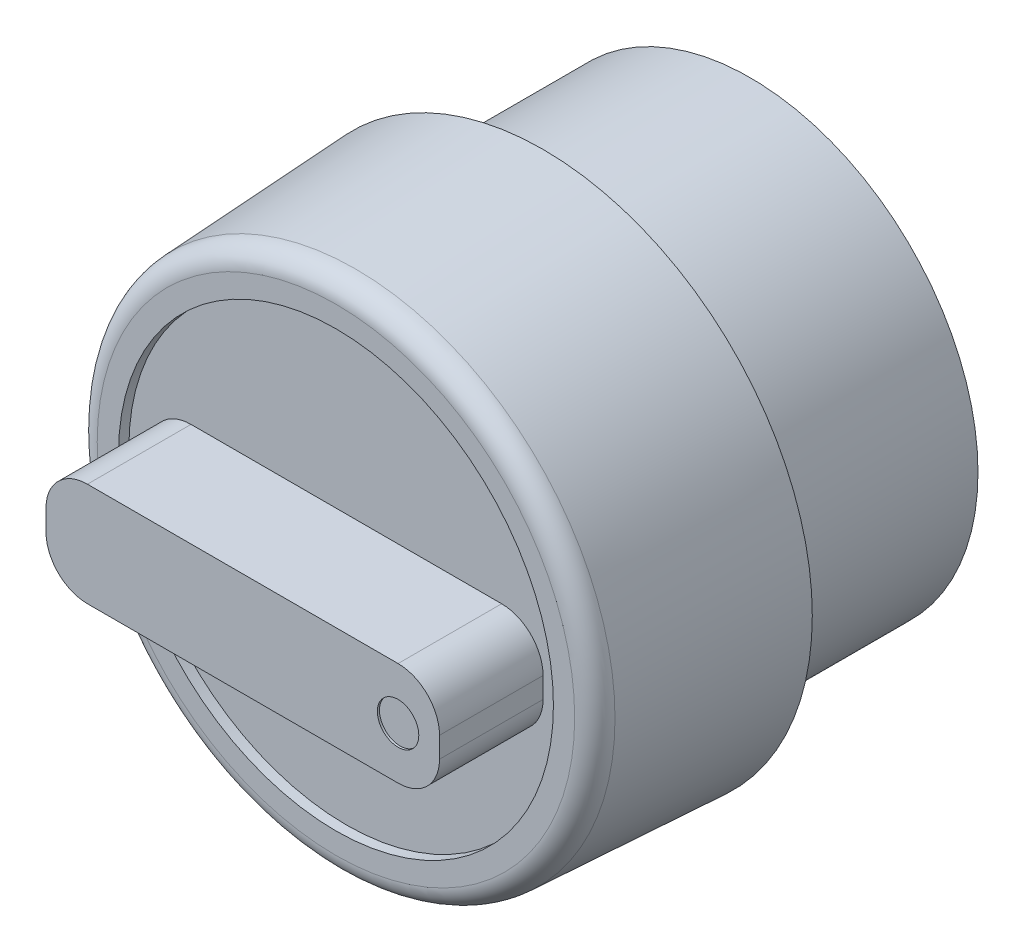
ISO-10303-21;
HEADER;
FILE_DESCRIPTION(('STEP AP214'),'2;1');
FILE_NAME('part.step','',(''),(''),'','','');
FILE_SCHEMA(('AUTOMOTIVE_DESIGN { 1 0 10303 214 1 1 1 1 }'));
ENDSEC;
DATA;
#1=APPLICATION_CONTEXT('core data for automotive mechanical design processes');
#2=APPLICATION_PROTOCOL_DEFINITION('international standard','automotive_design',2000,#1);
#3=PRODUCT_CONTEXT('',#1,'mechanical');
#4=PRODUCT('Part','Part','',(#3));
#5=PRODUCT_RELATED_PRODUCT_CATEGORY('part','',(#4));
#6=PRODUCT_DEFINITION_FORMATION('','',#4);
#7=PRODUCT_DEFINITION_CONTEXT('part definition',#1,'design');
#8=PRODUCT_DEFINITION('design','',#6,#7);
#9=PRODUCT_DEFINITION_SHAPE('','',#8);
#10=(LENGTH_UNIT() NAMED_UNIT(*) SI_UNIT(.MILLI.,.METRE.));
#11=(NAMED_UNIT(*) PLANE_ANGLE_UNIT() SI_UNIT($,.RADIAN.));
#12=(NAMED_UNIT(*) SI_UNIT($,.STERADIAN.) SOLID_ANGLE_UNIT());
#13=UNCERTAINTY_MEASURE_WITH_UNIT(LENGTH_MEASURE(1.E-05),#10,'distance_accuracy_value','');
#14=(GEOMETRIC_REPRESENTATION_CONTEXT(3) GLOBAL_UNCERTAINTY_ASSIGNED_CONTEXT((#13)) GLOBAL_UNIT_ASSIGNED_CONTEXT((#10,
#11,#12)) REPRESENTATION_CONTEXT('',''));
#15=CARTESIAN_POINT('',(0.,0.,0.));
#16=DIRECTION('',(0.,0.,1.));
#17=DIRECTION('',(1.,0.,0.));
#18=AXIS2_PLACEMENT_3D('',#15,#16,#17);
#19=CARTESIAN_POINT('',(0.,0.,19.5));
#20=DIRECTION('',(0.,0.,1.));
#21=DIRECTION('',(1.,0.,0.));
#22=AXIS2_PLACEMENT_3D('',#19,#20,#21);
#23=PLANE('',#22);
#24=CARTESIAN_POINT('',(0.,0.,19.5));
#25=DIRECTION('',(0.,0.,1.));
#26=DIRECTION('',(1.,0.,0.));
#27=AXIS2_PLACEMENT_3D('',#24,#25,#26);
#28=CIRCLE('',#27,10.5);
#29=CARTESIAN_POINT('',(10.5,0.,19.5));
#30=VERTEX_POINT('',#29);
#31=EDGE_CURVE('E131',#30,#30,#28,.T.);
#32=ORIENTED_EDGE('',*,*,#31,.T.);
#33=EDGE_LOOP('',(#32));
#34=FACE_BOUND('',#33,.T.);
#35=DIRECTION('',(1.,0.,0.));
#36=VECTOR('',#35,1.);
#37=CARTESIAN_POINT('',(-9.5,-2.5,19.5));
#38=LINE('',#37,#36);
#39=CARTESIAN_POINT('',(-7.5,-2.5,19.5));
#40=VERTEX_POINT('',#39);
#41=CARTESIAN_POINT('',(7.5,-2.5,19.5));
#42=VERTEX_POINT('',#41);
#43=EDGE_CURVE('E127',#40,#42,#38,.T.);
#44=ORIENTED_EDGE('',*,*,#43,.F.);
#45=CARTESIAN_POINT('',(-7.5,-0.5,19.5));
#46=DIRECTION('',(0.,0.,1.));
#47=DIRECTION('',(1.,0.,0.));
#48=AXIS2_PLACEMENT_3D('',#45,#46,#47);
#49=CIRCLE('',#48,2.);
#50=CARTESIAN_POINT('',(-9.5,-0.5,19.5));
#51=VERTEX_POINT('',#50);
#52=EDGE_CURVE('E11',#40,#51,#49,.F.);
#53=ORIENTED_EDGE('',*,*,#52,.T.);
#54=DIRECTION('',(0.,-1.,0.));
#55=VECTOR('',#54,1.);
#56=CARTESIAN_POINT('',(-9.5,2.5,19.5));
#57=LINE('',#56,#55);
#58=CARTESIAN_POINT('',(-9.5,0.5,19.5));
#59=VERTEX_POINT('',#58);
#60=EDGE_CURVE('E181',#59,#51,#57,.T.);
#61=ORIENTED_EDGE('',*,*,#60,.F.);
#62=CARTESIAN_POINT('',(-7.5,0.5,19.5));
#63=DIRECTION('',(0.,0.,1.));
#64=DIRECTION('',(1.,0.,0.));
#65=AXIS2_PLACEMENT_3D('',#62,#63,#64);
#66=CIRCLE('',#65,2.);
#67=CARTESIAN_POINT('',(-7.5,2.5,19.5));
#68=VERTEX_POINT('',#67);
#69=EDGE_CURVE('E43',#59,#68,#66,.F.);
#70=ORIENTED_EDGE('',*,*,#69,.T.);
#71=DIRECTION('',(-1.,0.,0.));
#72=VECTOR('',#71,1.);
#73=CARTESIAN_POINT('',(-9.5,2.5,19.5));
#74=LINE('',#73,#72);
#75=CARTESIAN_POINT('',(7.5,2.5,19.5));
#76=VERTEX_POINT('',#75);
#77=EDGE_CURVE('E115',#76,#68,#74,.T.);
#78=ORIENTED_EDGE('',*,*,#77,.F.);
#79=CARTESIAN_POINT('',(7.5,0.5,19.5));
#80=DIRECTION('',(0.,0.,1.));
#81=DIRECTION('',(1.,0.,0.));
#82=AXIS2_PLACEMENT_3D('',#79,#80,#81);
#83=CIRCLE('',#82,2.);
#84=CARTESIAN_POINT('',(9.5,0.5,19.5));
#85=VERTEX_POINT('',#84);
#86=EDGE_CURVE('E99',#76,#85,#83,.F.);
#87=ORIENTED_EDGE('',*,*,#86,.T.);
#88=DIRECTION('',(0.,1.,0.));
#89=VECTOR('',#88,1.);
#90=CARTESIAN_POINT('',(9.5,2.5,19.5));
#91=LINE('',#90,#89);
#92=CARTESIAN_POINT('',(9.5,-0.500000000000001,19.5));
#93=VERTEX_POINT('',#92);
#94=EDGE_CURVE('E122',#93,#85,#91,.T.);
#95=ORIENTED_EDGE('',*,*,#94,.F.);
#96=CARTESIAN_POINT('',(7.5,-0.500000000000001,19.5));
#97=DIRECTION('',(0.,0.,1.));
#98=DIRECTION('',(1.,0.,0.));
#99=AXIS2_PLACEMENT_3D('',#96,#97,#98);
#100=CIRCLE('',#99,2.);
#101=EDGE_CURVE('E108',#93,#42,#100,.F.);
#102=ORIENTED_EDGE('',*,*,#101,.T.);
#103=EDGE_LOOP('',(#44,#53,#61,#70,#78,#87,#95,#102));
#104=FACE_BOUND('',#103,.T.);
#105=ADVANCED_FACE('F35',(#34,#104),#23,.T.);
#106=CARTESIAN_POINT('',(0.,0.,10.));
#107=DIRECTION('',(0.,0.,-1.));
#108=DIRECTION('',(-1.,0.,0.));
#109=AXIS2_PLACEMENT_3D('',#106,#107,#108);
#110=CYLINDRICAL_SURFACE('',#109,11.);
#111=CARTESIAN_POINT('',(0.,0.,10.));
#112=DIRECTION('',(0.,0.,1.));
#113=DIRECTION('',(1.,0.,0.));
#114=AXIS2_PLACEMENT_3D('',#111,#112,#113);
#115=CIRCLE('',#114,11.);
#116=CARTESIAN_POINT('',(11.,0.,10.));
#117=VERTEX_POINT('',#116);
#118=EDGE_CURVE('E141',#117,#117,#115,.T.);
#119=ORIENTED_EDGE('',*,*,#118,.F.);
#120=EDGE_LOOP('',(#119));
#121=FACE_BOUND('',#120,.T.);
#122=CARTESIAN_POINT('',(0.,0.,0.));
#123=DIRECTION('',(0.,0.,1.));
#124=DIRECTION('',(1.,0.,0.));
#125=AXIS2_PLACEMENT_3D('',#122,#123,#124);
#126=CIRCLE('',#125,11.);
#127=CARTESIAN_POINT('',(11.,0.,0.));
#128=VERTEX_POINT('',#127);
#129=EDGE_CURVE('E140',#128,#128,#126,.T.);
#130=ORIENTED_EDGE('',*,*,#129,.T.);
#131=EDGE_LOOP('',(#130));
#132=FACE_BOUND('',#131,.T.);
#133=ADVANCED_FACE('F219',(#121,#132),#110,.T.);
#134=CARTESIAN_POINT('',(0.,0.,0.));
#135=DIRECTION('',(0.,0.,1.));
#136=DIRECTION('',(1.,0.,0.));
#137=AXIS2_PLACEMENT_3D('',#134,#135,#136);
#138=PLANE('',#137);
#139=ORIENTED_EDGE('',*,*,#129,.F.);
#140=EDGE_LOOP('',(#139));
#141=FACE_BOUND('',#140,.T.);
#142=ADVANCED_FACE('F225',(#141),#138,.F.);
#143=CARTESIAN_POINT('',(0.,0.,10.));
#144=DIRECTION('',(0.,0.,1.));
#145=DIRECTION('',(1.,0.,0.));
#146=AXIS2_PLACEMENT_3D('',#143,#144,#145);
#147=PLANE('',#146);
#148=CARTESIAN_POINT('',(0.,0.,10.));
#149=DIRECTION('',(0.,0.,1.));
#150=DIRECTION('',(1.,0.,0.));
#151=AXIS2_PLACEMENT_3D('',#148,#149,#150);
#152=CIRCLE('',#151,13.);
#153=CARTESIAN_POINT('',(13.,0.,10.));
#154=VERTEX_POINT('',#153);
#155=EDGE_CURVE('E134',#154,#154,#152,.T.);
#156=ORIENTED_EDGE('',*,*,#155,.F.);
#157=EDGE_LOOP('',(#156));
#158=FACE_BOUND('',#157,.T.);
#159=ORIENTED_EDGE('',*,*,#118,.T.);
#160=EDGE_LOOP('',(#159));
#161=FACE_BOUND('',#160,.T.);
#162=ADVANCED_FACE('F242',(#158,#161),#147,.F.);
#163=CARTESIAN_POINT('',(0.,0.,10.));
#164=DIRECTION('',(0.,0.,-1.));
#165=DIRECTION('',(1.,0.,0.));
#166=AXIS2_PLACEMENT_3D('',#163,#164,#165);
#167=CONICAL_SURFACE('',#166,13.,0.05235987755983);
#168=CARTESIAN_POINT('',(0.,0.,19.0523359562429));
#169=DIRECTION('',(0.,0.,-1.));
#170=DIRECTION('',(-1.,0.,0.));
#171=AXIS2_PLACEMENT_3D('',#168,#169,#170);
#172=CIRCLE('',#171,12.5255871752093);
#173=CARTESIAN_POINT('',(-12.5255871752093,0.,19.0523359562429));
#174=VERTEX_POINT('',#173);
#175=EDGE_CURVE('E149',#174,#174,#172,.T.);
#176=ORIENTED_EDGE('',*,*,#175,.T.);
#177=EDGE_LOOP('',(#176));
#178=FACE_BOUND('',#177,.T.);
#179=ORIENTED_EDGE('',*,*,#155,.T.);
#180=EDGE_LOOP('',(#179));
#181=FACE_BOUND('',#180,.T.);
#182=ADVANCED_FACE('F240',(#178,#181),#167,.T.);
#183=CARTESIAN_POINT('',(0.,0.,20.));
#184=DIRECTION('',(0.,0.,1.));
#185=DIRECTION('',(1.,0.,0.));
#186=AXIS2_PLACEMENT_3D('',#183,#184,#185);
#187=PLANE('',#186);
#188=CARTESIAN_POINT('',(0.,0.,20.));
#189=DIRECTION('',(0.,0.,1.));
#190=DIRECTION('',(1.,0.,0.));
#191=AXIS2_PLACEMENT_3D('',#188,#189,#190);
#192=CIRCLE('',#191,10.5);
#193=CARTESIAN_POINT('',(10.5,0.,20.));
#194=VERTEX_POINT('',#193);
#195=EDGE_CURVE('E135',#194,#194,#192,.T.);
#196=ORIENTED_EDGE('',*,*,#195,.F.);
#197=EDGE_LOOP('',(#196));
#198=FACE_BOUND('',#197,.T.);
#199=CARTESIAN_POINT('',(0.,0.,20.));
#200=DIRECTION('',(0.,0.,1.));
#201=DIRECTION('',(1.,0.,0.));
#202=AXIS2_PLACEMENT_3D('',#199,#200,#201);
#203=CIRCLE('',#202,11.5269576404547);
#204=CARTESIAN_POINT('',(11.5269576404547,0.,20.));
#205=VERTEX_POINT('',#204);
#206=EDGE_CURVE('E144',#205,#205,#203,.T.);
#207=ORIENTED_EDGE('',*,*,#206,.T.);
#208=EDGE_LOOP('',(#207));
#209=FACE_BOUND('',#208,.T.);
#210=ADVANCED_FACE('F237',(#198,#209),#187,.T.);
#211=CARTESIAN_POINT('',(0.,0.,19.));
#212=DIRECTION('',(0.,0.,1.));
#213=DIRECTION('',(1.,0.,0.));
#214=AXIS2_PLACEMENT_3D('',#211,#212,#213);
#215=TOROIDAL_SURFACE('',#214,11.5269576404547,1.);
#216=ORIENTED_EDGE('',*,*,#175,.F.);
#217=EDGE_LOOP('',(#216));
#218=FACE_BOUND('',#217,.T.);
#219=ORIENTED_EDGE('',*,*,#206,.F.);
#220=EDGE_LOOP('',(#219));
#221=FACE_BOUND('',#220,.T.);
#222=ADVANCED_FACE('F235',(#218,#221),#215,.T.);
#223=CARTESIAN_POINT('',(0.,0.,19.5));
#224=DIRECTION('',(0.,0.,1.));
#225=DIRECTION('',(1.,0.,0.));
#226=AXIS2_PLACEMENT_3D('',#223,#224,#225);
#227=CYLINDRICAL_SURFACE('',#226,10.5);
#228=ORIENTED_EDGE('',*,*,#31,.F.);
#229=EDGE_LOOP('',(#228));
#230=FACE_BOUND('',#229,.T.);
#231=ORIENTED_EDGE('',*,*,#195,.T.);
#232=EDGE_LOOP('',(#231));
#233=FACE_BOUND('',#232,.T.);
#234=ADVANCED_FACE('F232',(#230,#233),#227,.F.);
#235=CARTESIAN_POINT('',(-9.5,2.5,24.5));
#236=DIRECTION('',(1.,0.,0.));
#237=DIRECTION('',(0.,0.,-1.));
#238=AXIS2_PLACEMENT_3D('',#235,#236,#237);
#239=PLANE('',#238);
#240=DIRECTION('',(0.,-1.,0.));
#241=VECTOR('',#240,1.);
#242=CARTESIAN_POINT('',(-9.5,2.5,24.5));
#243=LINE('',#242,#241);
#244=CARTESIAN_POINT('',(-9.5,0.5,24.5));
#245=VERTEX_POINT('',#244);
#246=CARTESIAN_POINT('',(-9.5,-0.5,24.5));
#247=VERTEX_POINT('',#246);
#248=EDGE_CURVE('E121',#245,#247,#243,.T.);
#249=ORIENTED_EDGE('',*,*,#248,.F.);
#250=DIRECTION('',(0.,0.,-1.));
#251=VECTOR('',#250,1.);
#252=CARTESIAN_POINT('',(-9.5,0.5,24.5));
#253=LINE('',#252,#251);
#254=EDGE_CURVE('E109',#245,#59,#253,.T.);
#255=ORIENTED_EDGE('',*,*,#254,.T.);
#256=ORIENTED_EDGE('',*,*,#60,.T.);
#257=DIRECTION('',(0.,0.,-1.));
#258=VECTOR('',#257,1.);
#259=CARTESIAN_POINT('',(-9.5,-0.5,24.5));
#260=LINE('',#259,#258);
#261=EDGE_CURVE('E169',#51,#247,#260,.F.);
#262=ORIENTED_EDGE('',*,*,#261,.T.);
#263=EDGE_LOOP('',(#249,#255,#256,#262));
#264=FACE_BOUND('',#263,.T.);
#265=ADVANCED_FACE('F230',(#264),#239,.F.);
#266=CARTESIAN_POINT('',(-9.5,-2.5,24.5));
#267=DIRECTION('',(0.,1.,0.));
#268=DIRECTION('',(-1.,0.,0.));
#269=AXIS2_PLACEMENT_3D('',#266,#267,#268);
#270=PLANE('',#269);
#271=ORIENTED_EDGE('',*,*,#43,.T.);
#272=DIRECTION('',(0.,0.,-1.));
#273=VECTOR('',#272,1.);
#274=CARTESIAN_POINT('',(7.5,-2.5,24.5));
#275=LINE('',#274,#273);
#276=CARTESIAN_POINT('',(7.5,-2.5,24.5));
#277=VERTEX_POINT('',#276);
#278=EDGE_CURVE('E167',#42,#277,#275,.F.);
#279=ORIENTED_EDGE('',*,*,#278,.T.);
#280=DIRECTION('',(1.,0.,0.));
#281=VECTOR('',#280,1.);
#282=CARTESIAN_POINT('',(-9.5,-2.5,24.5));
#283=LINE('',#282,#281);
#284=CARTESIAN_POINT('',(-7.5,-2.5,24.5));
#285=VERTEX_POINT('',#284);
#286=EDGE_CURVE('E125',#285,#277,#283,.T.);
#287=ORIENTED_EDGE('',*,*,#286,.F.);
#288=DIRECTION('',(0.,0.,-1.));
#289=VECTOR('',#288,1.);
#290=CARTESIAN_POINT('',(-7.5,-2.5,24.5));
#291=LINE('',#290,#289);
#292=EDGE_CURVE('E164',#285,#40,#291,.T.);
#293=ORIENTED_EDGE('',*,*,#292,.T.);
#294=EDGE_LOOP('',(#271,#279,#287,#293));
#295=FACE_BOUND('',#294,.T.);
#296=ADVANCED_FACE('F177',(#295),#270,.F.);
#297=CARTESIAN_POINT('',(9.5,2.5,24.5));
#298=DIRECTION('',(-1.,0.,0.));
#299=DIRECTION('',(0.,0.,1.));
#300=AXIS2_PLACEMENT_3D('',#297,#298,#299);
#301=PLANE('',#300);
#302=ORIENTED_EDGE('',*,*,#94,.T.);
#303=DIRECTION('',(0.,0.,-1.));
#304=VECTOR('',#303,1.);
#305=CARTESIAN_POINT('',(9.5,0.5,24.5));
#306=LINE('',#305,#304);
#307=CARTESIAN_POINT('',(9.5,0.5,24.5));
#308=VERTEX_POINT('',#307);
#309=EDGE_CURVE('E104',#85,#308,#306,.F.);
#310=ORIENTED_EDGE('',*,*,#309,.T.);
#311=DIRECTION('',(0.,1.,0.));
#312=VECTOR('',#311,1.);
#313=CARTESIAN_POINT('',(9.5,2.5,24.5));
#314=LINE('',#313,#312);
#315=CARTESIAN_POINT('',(9.5,-0.500000000000001,24.5));
#316=VERTEX_POINT('',#315);
#317=EDGE_CURVE('E188',#316,#308,#314,.T.);
#318=ORIENTED_EDGE('',*,*,#317,.F.);
#319=DIRECTION('',(0.,0.,-1.));
#320=VECTOR('',#319,1.);
#321=CARTESIAN_POINT('',(9.5,-0.500000000000001,24.5));
#322=LINE('',#321,#320);
#323=EDGE_CURVE('E118',#316,#93,#322,.T.);
#324=ORIENTED_EDGE('',*,*,#323,.T.);
#325=EDGE_LOOP('',(#302,#310,#318,#324));
#326=FACE_BOUND('',#325,.T.);
#327=ADVANCED_FACE('F190',(#326),#301,.F.);
#328=CARTESIAN_POINT('',(-9.5,2.5,24.5));
#329=DIRECTION('',(0.,-1.,0.));
#330=DIRECTION('',(0.,0.,-1.));
#331=AXIS2_PLACEMENT_3D('',#328,#329,#330);
#332=PLANE('',#331);
#333=DIRECTION('',(-1.,0.,0.));
#334=VECTOR('',#333,1.);
#335=CARTESIAN_POINT('',(-9.5,2.5,24.5));
#336=LINE('',#335,#334);
#337=CARTESIAN_POINT('',(7.5,2.5,24.5));
#338=VERTEX_POINT('',#337);
#339=CARTESIAN_POINT('',(-7.5,2.5,24.5));
#340=VERTEX_POINT('',#339);
#341=EDGE_CURVE('E117',#338,#340,#336,.T.);
#342=ORIENTED_EDGE('',*,*,#341,.F.);
#343=DIRECTION('',(0.,0.,-1.));
#344=VECTOR('',#343,1.);
#345=CARTESIAN_POINT('',(7.5,2.5,24.5));
#346=LINE('',#345,#344);
#347=EDGE_CURVE('E103',#338,#76,#346,.T.);
#348=ORIENTED_EDGE('',*,*,#347,.T.);
#349=ORIENTED_EDGE('',*,*,#77,.T.);
#350=DIRECTION('',(0.,0.,-1.));
#351=VECTOR('',#350,1.);
#352=CARTESIAN_POINT('',(-7.5,2.5,24.5));
#353=LINE('',#352,#351);
#354=EDGE_CURVE('E119',#68,#340,#353,.F.);
#355=ORIENTED_EDGE('',*,*,#354,.T.);
#356=EDGE_LOOP('',(#342,#348,#349,#355));
#357=FACE_BOUND('',#356,.T.);
#358=ADVANCED_FACE('F114',(#357),#332,.F.);
#359=CARTESIAN_POINT('',(-9.5,-2.5,24.5));
#360=DIRECTION('',(0.,0.,1.));
#361=DIRECTION('',(1.,0.,0.));
#362=AXIS2_PLACEMENT_3D('',#359,#360,#361);
#363=PLANE('',#362);
#364=CARTESIAN_POINT('',(7.5,0.,24.5));
#365=DIRECTION('',(0.,0.,1.));
#366=DIRECTION('',(1.,0.,0.));
#367=AXIS2_PLACEMENT_3D('',#364,#365,#366);
#368=CIRCLE('',#367,1.);
#369=CARTESIAN_POINT('',(8.5,0.,24.5));
#370=VERTEX_POINT('',#369);
#371=EDGE_CURVE('E199',#370,#370,#368,.T.);
#372=ORIENTED_EDGE('',*,*,#371,.F.);
#373=EDGE_LOOP('',(#372));
#374=FACE_BOUND('',#373,.T.);
#375=ORIENTED_EDGE('',*,*,#317,.T.);
#376=CARTESIAN_POINT('',(7.5,0.5,24.5));
#377=DIRECTION('',(0.,0.,1.));
#378=DIRECTION('',(1.,0.,0.));
#379=AXIS2_PLACEMENT_3D('',#376,#377,#378);
#380=CIRCLE('',#379,2.);
#381=EDGE_CURVE('E162',#308,#338,#380,.T.);
#382=ORIENTED_EDGE('',*,*,#381,.T.);
#383=ORIENTED_EDGE('',*,*,#341,.T.);
#384=CARTESIAN_POINT('',(-7.5,0.5,24.5));
#385=DIRECTION('',(0.,0.,1.));
#386=DIRECTION('',(1.,0.,0.));
#387=AXIS2_PLACEMENT_3D('',#384,#385,#386);
#388=CIRCLE('',#387,2.);
#389=EDGE_CURVE('E158',#340,#245,#388,.T.);
#390=ORIENTED_EDGE('',*,*,#389,.T.);
#391=ORIENTED_EDGE('',*,*,#248,.T.);
#392=CARTESIAN_POINT('',(-7.5,-0.5,24.5));
#393=DIRECTION('',(0.,0.,1.));
#394=DIRECTION('',(1.,0.,0.));
#395=AXIS2_PLACEMENT_3D('',#392,#393,#394);
#396=CIRCLE('',#395,2.);
#397=EDGE_CURVE('E156',#247,#285,#396,.T.);
#398=ORIENTED_EDGE('',*,*,#397,.T.);
#399=ORIENTED_EDGE('',*,*,#286,.T.);
#400=CARTESIAN_POINT('',(7.5,-0.500000000000001,24.5));
#401=DIRECTION('',(0.,0.,1.));
#402=DIRECTION('',(1.,0.,0.));
#403=AXIS2_PLACEMENT_3D('',#400,#401,#402);
#404=CIRCLE('',#403,2.);
#405=EDGE_CURVE('E160',#277,#316,#404,.T.);
#406=ORIENTED_EDGE('',*,*,#405,.T.);
#407=EDGE_LOOP('',(#375,#382,#383,#390,#391,#398,#399,#406));
#408=FACE_BOUND('',#407,.T.);
#409=ADVANCED_FACE('F187',(#374,#408),#363,.T.);
#410=CARTESIAN_POINT('',(7.5,0.5,24.5));
#411=DIRECTION('',(0.,0.,-1.));
#412=DIRECTION('',(-1.,0.,0.));
#413=AXIS2_PLACEMENT_3D('',#410,#411,#412);
#414=CYLINDRICAL_SURFACE('',#413,2.);
#415=ORIENTED_EDGE('',*,*,#381,.F.);
#416=ORIENTED_EDGE('',*,*,#309,.F.);
#417=ORIENTED_EDGE('',*,*,#86,.F.);
#418=ORIENTED_EDGE('',*,*,#347,.F.);
#419=EDGE_LOOP('',(#415,#416,#417,#418));
#420=FACE_BOUND('',#419,.T.);
#421=ADVANCED_FACE('F102',(#420),#414,.T.);
#422=CARTESIAN_POINT('',(7.5,-0.500000000000001,24.5));
#423=DIRECTION('',(0.,0.,-1.));
#424=DIRECTION('',(-1.,0.,0.));
#425=AXIS2_PLACEMENT_3D('',#422,#423,#424);
#426=CYLINDRICAL_SURFACE('',#425,2.);
#427=ORIENTED_EDGE('',*,*,#405,.F.);
#428=ORIENTED_EDGE('',*,*,#278,.F.);
#429=ORIENTED_EDGE('',*,*,#101,.F.);
#430=ORIENTED_EDGE('',*,*,#323,.F.);
#431=EDGE_LOOP('',(#427,#428,#429,#430));
#432=FACE_BOUND('',#431,.T.);
#433=ADVANCED_FACE('F183',(#432),#426,.T.);
#434=CARTESIAN_POINT('',(-7.5,0.5,24.5));
#435=DIRECTION('',(0.,0.,-1.));
#436=DIRECTION('',(-1.,0.,0.));
#437=AXIS2_PLACEMENT_3D('',#434,#435,#436);
#438=CYLINDRICAL_SURFACE('',#437,2.);
#439=ORIENTED_EDGE('',*,*,#389,.F.);
#440=ORIENTED_EDGE('',*,*,#354,.F.);
#441=ORIENTED_EDGE('',*,*,#69,.F.);
#442=ORIENTED_EDGE('',*,*,#254,.F.);
#443=EDGE_LOOP('',(#439,#440,#441,#442));
#444=FACE_BOUND('',#443,.T.);
#445=ADVANCED_FACE('F256',(#444),#438,.T.);
#446=CARTESIAN_POINT('',(-7.5,-0.5,24.5));
#447=DIRECTION('',(0.,0.,-1.));
#448=DIRECTION('',(-1.,0.,0.));
#449=AXIS2_PLACEMENT_3D('',#446,#447,#448);
#450=CYLINDRICAL_SURFACE('',#449,2.);
#451=ORIENTED_EDGE('',*,*,#397,.F.);
#452=ORIENTED_EDGE('',*,*,#261,.F.);
#453=ORIENTED_EDGE('',*,*,#52,.F.);
#454=ORIENTED_EDGE('',*,*,#292,.F.);
#455=EDGE_LOOP('',(#451,#452,#453,#454));
#456=FACE_BOUND('',#455,.T.);
#457=ADVANCED_FACE('F37',(#456),#450,.T.);
#458=CARTESIAN_POINT('',(7.5,0.,24.4));
#459=DIRECTION('',(0.,0.,1.));
#460=DIRECTION('',(1.,0.,0.));
#461=AXIS2_PLACEMENT_3D('',#458,#459,#460);
#462=CYLINDRICAL_SURFACE('',#461,1.);
#463=CARTESIAN_POINT('',(7.5,0.,24.4));
#464=DIRECTION('',(0.,0.,1.));
#465=DIRECTION('',(1.,0.,0.));
#466=AXIS2_PLACEMENT_3D('',#463,#464,#465);
#467=CIRCLE('',#466,1.);
#468=CARTESIAN_POINT('',(8.5,0.,24.4));
#469=VERTEX_POINT('',#468);
#470=EDGE_CURVE('E195',#469,#469,#467,.T.);
#471=ORIENTED_EDGE('',*,*,#470,.F.);
#472=EDGE_LOOP('',(#471));
#473=FACE_BOUND('',#472,.T.);
#474=ORIENTED_EDGE('',*,*,#371,.T.);
#475=EDGE_LOOP('',(#474));
#476=FACE_BOUND('',#475,.T.);
#477=ADVANCED_FACE('F207',(#473,#476),#462,.F.);
#478=CARTESIAN_POINT('',(7.5,0.,24.4));
#479=DIRECTION('',(0.,0.,1.));
#480=DIRECTION('',(1.,0.,0.));
#481=AXIS2_PLACEMENT_3D('',#478,#479,#480);
#482=PLANE('',#481);
#483=ORIENTED_EDGE('',*,*,#470,.T.);
#484=EDGE_LOOP('',(#483));
#485=FACE_BOUND('',#484,.T.);
#486=ADVANCED_FACE('F314',(#485),#482,.T.);
#487=CLOSED_SHELL('',(#105,#133,#142,#162,#182,#210,#222,#234,#265,#296,#327,#358,#409,#421,
#433,#445,#457,#477,#486));
#488=MANIFOLD_SOLID_BREP('B2',#487);
#489=ADVANCED_BREP_SHAPE_REPRESENTATION('',(#18,#488),#14);
#490=SHAPE_DEFINITION_REPRESENTATION(#9,#489);
ENDSEC;
END-ISO-10303-21;
